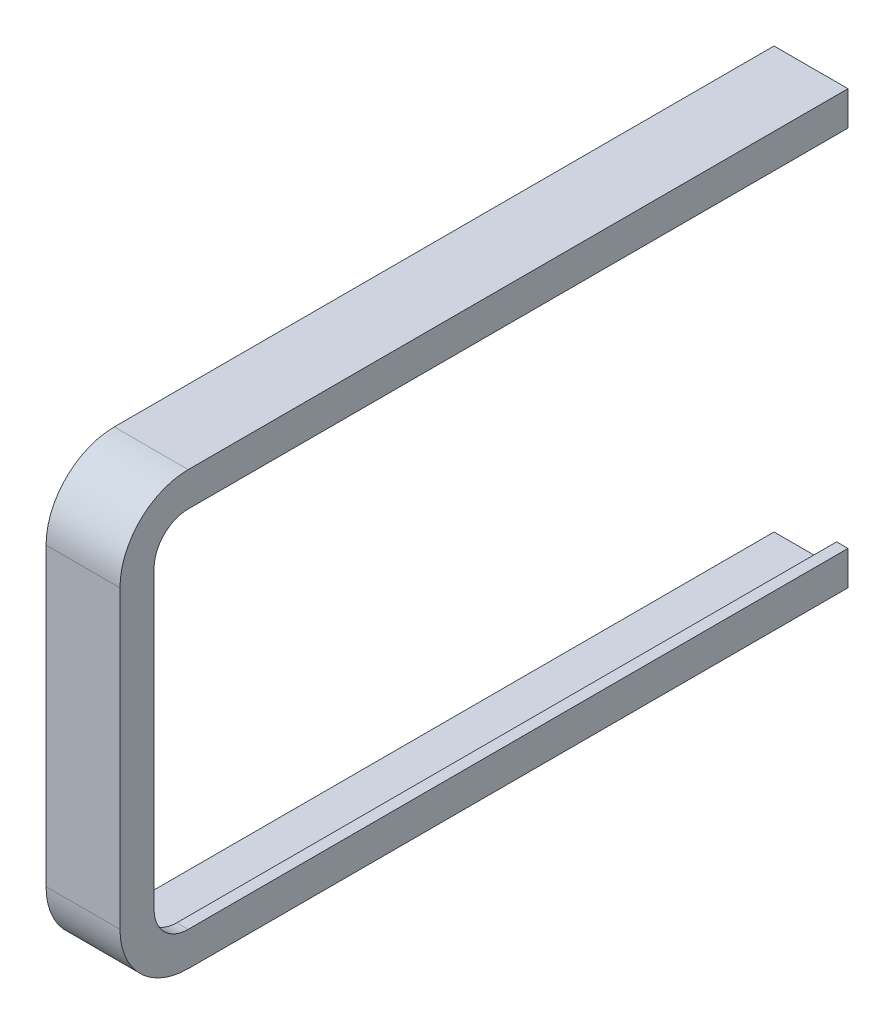
ISO-10303-21;
HEADER;
FILE_DESCRIPTION(('STEP AP214'),'2;1');
FILE_NAME('part.step','',(''),(''),'','','');
FILE_SCHEMA(('AUTOMOTIVE_DESIGN { 1 0 10303 214 1 1 1 1 }'));
ENDSEC;
DATA;
#1=APPLICATION_CONTEXT('core data for automotive mechanical design processes');
#2=APPLICATION_PROTOCOL_DEFINITION('international standard','automotive_design',2000,#1);
#3=PRODUCT_CONTEXT('',#1,'mechanical');
#4=PRODUCT('Part','Part','',(#3));
#5=PRODUCT_RELATED_PRODUCT_CATEGORY('part','',(#4));
#6=PRODUCT_DEFINITION_FORMATION('','',#4);
#7=PRODUCT_DEFINITION_CONTEXT('part definition',#1,'design');
#8=PRODUCT_DEFINITION('design','',#6,#7);
#9=PRODUCT_DEFINITION_SHAPE('','',#8);
#10=(LENGTH_UNIT() NAMED_UNIT(*) SI_UNIT(.MILLI.,.METRE.));
#11=(NAMED_UNIT(*) PLANE_ANGLE_UNIT() SI_UNIT($,.RADIAN.));
#12=(NAMED_UNIT(*) SI_UNIT($,.STERADIAN.) SOLID_ANGLE_UNIT());
#13=UNCERTAINTY_MEASURE_WITH_UNIT(LENGTH_MEASURE(1.E-05),#10,'distance_accuracy_value','');
#14=(GEOMETRIC_REPRESENTATION_CONTEXT(3) GLOBAL_UNCERTAINTY_ASSIGNED_CONTEXT((#13)) GLOBAL_UNIT_ASSIGNED_CONTEXT((#10,
#11,#12)) REPRESENTATION_CONTEXT('',''));
#15=CARTESIAN_POINT('',(0.,0.,0.));
#16=DIRECTION('',(0.,0.,1.));
#17=DIRECTION('',(1.,0.,0.));
#18=AXIS2_PLACEMENT_3D('',#15,#16,#17);
#19=CARTESIAN_POINT('',(86.141303169937,-53.8939234999562,0.));
#20=DIRECTION('',(-1.,0.,0.));
#21=DIRECTION('',(0.,-1.,0.));
#22=AXIS2_PLACEMENT_3D('',#19,#20,#21);
#23=CYLINDRICAL_SURFACE('',#22,19.0500000000104);
#24=CARTESIAN_POINT('',(106.778803169939,-53.893923499956,1.94289029309402E-13));
#25=DIRECTION('',(-1.,0.,0.));
#26=DIRECTION('',(0.,-1.,0.));
#27=AXIS2_PLACEMENT_3D('',#24,#25,#26);
#28=CIRCLE('',#27,19.0500000000104);
#29=CARTESIAN_POINT('',(106.778803169939,-72.9439234999664,0.));
#30=VERTEX_POINT('',#29);
#31=CARTESIAN_POINT('',(106.778803169939,-53.893923499956,19.0500000000106));
#32=VERTEX_POINT('',#31);
#33=EDGE_CURVE('E40',#30,#32,#28,.T.);
#34=ORIENTED_EDGE('',*,*,#33,.T.);
#35=DIRECTION('',(-1.,0.,0.));
#36=VECTOR('',#35,1.);
#37=CARTESIAN_POINT('',(106.778803169939,-53.893923499956,19.0500000000106));
#38=LINE('',#37,#36);
#39=CARTESIAN_POINT('',(86.1413031699389,-53.8939234999562,19.0500000000104));
#40=VERTEX_POINT('',#39);
#41=EDGE_CURVE('E275',#32,#40,#38,.T.);
#42=ORIENTED_EDGE('',*,*,#41,.T.);
#43=CARTESIAN_POINT('',(86.1413031699391,-53.8939234999562,0.));
#44=DIRECTION('',(-1.,0.,0.));
#45=DIRECTION('',(0.,-1.,0.));
#46=AXIS2_PLACEMENT_3D('',#43,#44,#45);
#47=CIRCLE('',#46,19.0500000000104);
#48=CARTESIAN_POINT('',(86.1413031699393,-72.9439234999666,0.));
#49=VERTEX_POINT('',#48);
#50=EDGE_CURVE('E11',#49,#40,#47,.T.);
#51=ORIENTED_EDGE('',*,*,#50,.F.);
#52=DIRECTION('',(-1.,0.,0.));
#53=VECTOR('',#52,1.);
#54=CARTESIAN_POINT('',(106.778803169939,-72.9439234999664,0.));
#55=LINE('',#54,#53);
#56=EDGE_CURVE('E49',#30,#49,#55,.T.);
#57=ORIENTED_EDGE('',*,*,#56,.F.);
#58=EDGE_LOOP('',(#34,#42,#51,#57));
#59=FACE_BOUND('',#58,.T.);
#60=ADVANCED_FACE('F30',(#59),#23,.T.);
#61=CARTESIAN_POINT('',(106.778803169939,-63.4189234999666,2.35922392732846E-13));
#62=DIRECTION('',(-1.,0.,0.));
#63=DIRECTION('',(0.,-1.,0.));
#64=AXIS2_PLACEMENT_3D('',#61,#62,#63);
#65=PLANE('',#64);
#66=CARTESIAN_POINT('',(106.778803169939,-53.893923499956,1.94289029309402E-13));
#67=DIRECTION('',(-1.,0.,0.));
#68=DIRECTION('',(0.,-1.,0.));
#69=AXIS2_PLACEMENT_3D('',#66,#67,#68);
#70=CIRCLE('',#69,9.52500000001067);
#71=CARTESIAN_POINT('',(106.778803169939,-63.4189234999666,2.35922392732846E-13));
#72=VERTEX_POINT('',#71);
#73=CARTESIAN_POINT('',(106.778803169939,-53.8939234999559,9.52500000001086));
#74=VERTEX_POINT('',#73);
#75=EDGE_CURVE('E295',#72,#74,#70,.T.);
#76=ORIENTED_EDGE('',*,*,#75,.T.);
#77=DIRECTION('',(0.,1.,0.));
#78=VECTOR('',#77,1.);
#79=CARTESIAN_POINT('',(106.778803169939,-53.8939234999559,9.52500000001057));
#80=LINE('',#79,#78);
#81=CARTESIAN_POINT('',(106.778803169939,28.6560765000409,9.52500000001086));
#82=VERTEX_POINT('',#81);
#83=EDGE_CURVE('E217',#74,#82,#80,.T.);
#84=ORIENTED_EDGE('',*,*,#83,.T.);
#85=CARTESIAN_POINT('',(106.778803169939,28.6560765000407,1.94289029309402E-13));
#86=DIRECTION('',(-1.,0.,0.));
#87=DIRECTION('',(0.,0.,1.));
#88=AXIS2_PLACEMENT_3D('',#85,#86,#87);
#89=CIRCLE('',#88,9.52500000001067);
#90=CARTESIAN_POINT('',(106.778803169939,38.1810765000514,0.));
#91=VERTEX_POINT('',#90);
#92=EDGE_CURVE('E228',#82,#91,#89,.T.);
#93=ORIENTED_EDGE('',*,*,#92,.T.);
#94=DIRECTION('',(0.,0.,-1.));
#95=VECTOR('',#94,1.);
#96=CARTESIAN_POINT('',(106.778803169939,38.1810765000514,0.));
#97=LINE('',#96,#95);
#98=CARTESIAN_POINT('',(106.778803169939,38.1810765000501,-184.15));
#99=VERTEX_POINT('',#98);
#100=EDGE_CURVE('E168',#91,#99,#97,.T.);
#101=ORIENTED_EDGE('',*,*,#100,.T.);
#102=DIRECTION('',(0.,1.,0.));
#103=VECTOR('',#102,1.);
#104=CARTESIAN_POINT('',(106.778803169939,38.1810765000501,-184.15));
#105=LINE('',#104,#103);
#106=CARTESIAN_POINT('',(106.778803169939,47.7060765000499,-184.15));
#107=VERTEX_POINT('',#106);
#108=EDGE_CURVE('E162',#99,#107,#105,.T.);
#109=ORIENTED_EDGE('',*,*,#108,.T.);
#110=DIRECTION('',(0.,0.,-1.));
#111=VECTOR('',#110,1.);
#112=CARTESIAN_POINT('',(106.778803169939,47.7060765000511,0.));
#113=LINE('',#112,#111);
#114=CARTESIAN_POINT('',(106.778803169939,47.7060765000511,0.));
#115=VERTEX_POINT('',#114);
#116=EDGE_CURVE('E166',#115,#107,#113,.T.);
#117=ORIENTED_EDGE('',*,*,#116,.F.);
#118=CARTESIAN_POINT('',(106.778803169939,28.6560765000407,1.94289029309402E-13));
#119=DIRECTION('',(-1.,0.,0.));
#120=DIRECTION('',(0.,0.,1.));
#121=AXIS2_PLACEMENT_3D('',#118,#119,#120);
#122=CIRCLE('',#121,19.0500000000104);
#123=CARTESIAN_POINT('',(106.778803169939,28.6560765000409,19.0500000000106));
#124=VERTEX_POINT('',#123);
#125=EDGE_CURVE('E230',#124,#115,#122,.T.);
#126=ORIENTED_EDGE('',*,*,#125,.F.);
#127=DIRECTION('',(0.,1.,0.));
#128=VECTOR('',#127,1.);
#129=CARTESIAN_POINT('',(106.778803169939,-53.8939234999559,19.0500000000103));
#130=LINE('',#129,#128);
#131=EDGE_CURVE('E257',#32,#124,#130,.T.);
#132=ORIENTED_EDGE('',*,*,#131,.F.);
#133=ORIENTED_EDGE('',*,*,#33,.F.);
#134=DIRECTION('',(0.,0.,-1.));
#135=VECTOR('',#134,1.);
#136=CARTESIAN_POINT('',(106.778803169937,-72.9439234999491,8.88178419700125E-13));
#137=LINE('',#136,#135);
#138=CARTESIAN_POINT('',(106.778803169937,-72.9439234999504,-184.149999999999));
#139=VERTEX_POINT('',#138);
#140=EDGE_CURVE('E205',#30,#139,#137,.T.);
#141=ORIENTED_EDGE('',*,*,#140,.T.);
#142=DIRECTION('',(0.,1.,0.));
#143=VECTOR('',#142,1.);
#144=CARTESIAN_POINT('',(106.778803169937,-72.9439234999504,-184.149999999999));
#145=LINE('',#144,#143);
#146=CARTESIAN_POINT('',(106.778803169937,-63.4189234999502,-184.149999999999));
#147=VERTEX_POINT('',#146);
#148=EDGE_CURVE('E182',#139,#147,#145,.T.);
#149=ORIENTED_EDGE('',*,*,#148,.T.);
#150=DIRECTION('',(0.,0.,-1.));
#151=VECTOR('',#150,1.);
#152=CARTESIAN_POINT('',(106.778803169937,-63.4189234999489,8.88178419700125E-13));
#153=LINE('',#152,#151);
#154=EDGE_CURVE('E203',#72,#147,#153,.T.);
#155=ORIENTED_EDGE('',*,*,#154,.F.);
#156=EDGE_LOOP('',(#76,#84,#93,#101,#109,#117,#126,#132,#133,#141,#149,#155));
#157=FACE_BOUND('',#156,.T.);
#158=ADVANCED_FACE('F304',(#157),#65,.F.);
#159=CARTESIAN_POINT('',(86.141303169937,-53.8939234999562,0.));
#160=DIRECTION('',(-1.,0.,0.));
#161=DIRECTION('',(0.,-1.,0.));
#162=AXIS2_PLACEMENT_3D('',#159,#160,#161);
#163=CYLINDRICAL_SURFACE('',#162,9.52500000001066);
#164=CARTESIAN_POINT('',(103.603803169939,-53.893923499956,1.66533453693773E-13));
#165=DIRECTION('',(-1.,0.,0.));
#166=DIRECTION('',(0.,-1.,0.));
#167=AXIS2_PLACEMENT_3D('',#164,#165,#166);
#168=CIRCLE('',#167,9.52500000001065);
#169=CARTESIAN_POINT('',(103.603803169939,-63.4189234999666,2.08166817117217E-13));
#170=VERTEX_POINT('',#169);
#171=CARTESIAN_POINT('',(103.603803169939,-53.8939234999559,9.52500000001081));
#172=VERTEX_POINT('',#171);
#173=EDGE_CURVE('E292',#170,#172,#168,.T.);
#174=ORIENTED_EDGE('',*,*,#173,.T.);
#175=DIRECTION('',(1.,0.,0.));
#176=VECTOR('',#175,1.);
#177=CARTESIAN_POINT('',(103.603803169939,-53.8939234999559,9.52500000001081));
#178=LINE('',#177,#176);
#179=EDGE_CURVE('E266',#172,#74,#178,.T.);
#180=ORIENTED_EDGE('',*,*,#179,.T.);
#181=ORIENTED_EDGE('',*,*,#75,.F.);
#182=DIRECTION('',(1.,0.,0.));
#183=VECTOR('',#182,1.);
#184=CARTESIAN_POINT('',(103.603803169939,-63.4189234999666,2.08166817117217E-13));
#185=LINE('',#184,#183);
#186=EDGE_CURVE('E283',#170,#72,#185,.T.);
#187=ORIENTED_EDGE('',*,*,#186,.F.);
#188=EDGE_LOOP('',(#174,#180,#181,#187));
#189=FACE_BOUND('',#188,.T.);
#190=ADVANCED_FACE('F322',(#189),#163,.F.);
#191=CARTESIAN_POINT('',(103.603803169939,-69.7689234999667,1.04083408558608E-13));
#192=DIRECTION('',(1.,0.,0.));
#193=DIRECTION('',(0.,1.,0.));
#194=AXIS2_PLACEMENT_3D('',#191,#192,#193);
#195=PLANE('',#194);
#196=CARTESIAN_POINT('',(103.603803169939,-53.893923499956,1.66533453693773E-13));
#197=DIRECTION('',(-1.,0.,0.));
#198=DIRECTION('',(0.,-1.,0.));
#199=AXIS2_PLACEMENT_3D('',#196,#197,#198);
#200=CIRCLE('',#199,15.8750000000107);
#201=CARTESIAN_POINT('',(103.603803169939,-69.7689234999667,1.04083408558608E-13));
#202=VERTEX_POINT('',#201);
#203=CARTESIAN_POINT('',(103.603803169939,-53.893923499956,15.8750000000108));
#204=VERTEX_POINT('',#203);
#205=EDGE_CURVE('E289',#202,#204,#200,.T.);
#206=ORIENTED_EDGE('',*,*,#205,.T.);
#207=DIRECTION('',(0.,1.,0.));
#208=VECTOR('',#207,1.);
#209=CARTESIAN_POINT('',(103.603803169939,-53.8939234999559,15.8750000000106));
#210=LINE('',#209,#208);
#211=CARTESIAN_POINT('',(103.603803169939,28.6560765000409,15.8750000000109));
#212=VERTEX_POINT('',#211);
#213=EDGE_CURVE('E250',#204,#212,#210,.T.);
#214=ORIENTED_EDGE('',*,*,#213,.T.);
#215=CARTESIAN_POINT('',(103.603803169939,28.6560765000407,1.94289029309402E-13));
#216=DIRECTION('',(-1.,0.,0.));
#217=DIRECTION('',(0.,0.,1.));
#218=AXIS2_PLACEMENT_3D('',#215,#216,#217);
#219=CIRCLE('',#218,15.8750000000107);
#220=CARTESIAN_POINT('',(103.603803169939,44.5310765000514,0.));
#221=VERTEX_POINT('',#220);
#222=EDGE_CURVE('E223',#212,#221,#219,.T.);
#223=ORIENTED_EDGE('',*,*,#222,.T.);
#224=DIRECTION('',(0.,0.,-1.));
#225=VECTOR('',#224,1.);
#226=CARTESIAN_POINT('',(103.603803169939,44.5310765000514,0.));
#227=LINE('',#226,#225);
#228=CARTESIAN_POINT('',(103.603803169939,44.5310765000501,-184.15));
#229=VERTEX_POINT('',#228);
#230=EDGE_CURVE('E34',#221,#229,#227,.T.);
#231=ORIENTED_EDGE('',*,*,#230,.T.);
#232=DIRECTION('',(0.,-1.,0.));
#233=VECTOR('',#232,1.);
#234=CARTESIAN_POINT('',(103.603803169939,44.5310765000501,-184.15));
#235=LINE('',#234,#233);
#236=CARTESIAN_POINT('',(103.603803169939,38.1810765000501,-184.15));
#237=VERTEX_POINT('',#236);
#238=EDGE_CURVE('E152',#229,#237,#235,.T.);
#239=ORIENTED_EDGE('',*,*,#238,.T.);
#240=DIRECTION('',(0.,0.,-1.));
#241=VECTOR('',#240,1.);
#242=CARTESIAN_POINT('',(103.603803169939,38.1810765000514,0.));
#243=LINE('',#242,#241);
#244=CARTESIAN_POINT('',(103.603803169939,38.1810765000514,0.));
#245=VERTEX_POINT('',#244);
#246=EDGE_CURVE('E170',#245,#237,#243,.T.);
#247=ORIENTED_EDGE('',*,*,#246,.F.);
#248=CARTESIAN_POINT('',(103.603803169939,28.6560765000407,1.94289029309402E-13));
#249=DIRECTION('',(-1.,0.,0.));
#250=DIRECTION('',(0.,0.,1.));
#251=AXIS2_PLACEMENT_3D('',#248,#249,#250);
#252=CIRCLE('',#251,9.52500000001065);
#253=CARTESIAN_POINT('',(103.603803169939,28.6560765000409,9.52500000001085));
#254=VERTEX_POINT('',#253);
#255=EDGE_CURVE('E225',#254,#245,#252,.T.);
#256=ORIENTED_EDGE('',*,*,#255,.F.);
#257=DIRECTION('',(0.,1.,0.));
#258=VECTOR('',#257,1.);
#259=CARTESIAN_POINT('',(103.603803169939,-53.8939234999559,9.52500000001055));
#260=LINE('',#259,#258);
#261=EDGE_CURVE('E248',#172,#254,#260,.T.);
#262=ORIENTED_EDGE('',*,*,#261,.F.);
#263=ORIENTED_EDGE('',*,*,#173,.F.);
#264=DIRECTION('',(0.,0.,-1.));
#265=VECTOR('',#264,1.);
#266=CARTESIAN_POINT('',(103.603803169939,-63.4189234999489,8.88178419700125E-13));
#267=LINE('',#266,#265);
#268=CARTESIAN_POINT('',(103.603803169939,-63.4189234999502,-184.149999999999));
#269=VERTEX_POINT('',#268);
#270=EDGE_CURVE('E200',#170,#269,#267,.T.);
#271=ORIENTED_EDGE('',*,*,#270,.T.);
#272=DIRECTION('',(0.,-1.,0.));
#273=VECTOR('',#272,1.);
#274=CARTESIAN_POINT('',(103.603803169939,-69.76892349995,-184.149999999999));
#275=LINE('',#274,#273);
#276=CARTESIAN_POINT('',(103.603803169939,-69.76892349995,-184.149999999999));
#277=VERTEX_POINT('',#276);
#278=EDGE_CURVE('E191',#269,#277,#275,.T.);
#279=ORIENTED_EDGE('',*,*,#278,.T.);
#280=DIRECTION('',(0.,0.,-1.));
#281=VECTOR('',#280,1.);
#282=CARTESIAN_POINT('',(103.603803169939,-69.7689234999488,8.88178419700125E-13));
#283=LINE('',#282,#281);
#284=EDGE_CURVE('E197',#202,#277,#283,.T.);
#285=ORIENTED_EDGE('',*,*,#284,.F.);
#286=EDGE_LOOP('',(#206,#214,#223,#231,#239,#247,#256,#262,#263,#271,#279,#285));
#287=FACE_BOUND('',#286,.T.);
#288=ADVANCED_FACE('F313',(#287),#195,.F.);
#289=CARTESIAN_POINT('',(86.1413031699393,-72.9439234999666,0.));
#290=DIRECTION('',(1.,0.,0.));
#291=DIRECTION('',(0.,1.,0.));
#292=AXIS2_PLACEMENT_3D('',#289,#290,#291);
#293=PLANE('',#292);
#294=ORIENTED_EDGE('',*,*,#50,.T.);
#295=DIRECTION('',(0.,1.,0.));
#296=VECTOR('',#295,1.);
#297=CARTESIAN_POINT('',(86.1413031699389,-53.8939234999559,19.0500000000103));
#298=LINE('',#297,#296);
#299=CARTESIAN_POINT('',(86.1413031699391,28.6560765000409,19.0500000000106));
#300=VERTEX_POINT('',#299);
#301=EDGE_CURVE('E256',#40,#300,#298,.T.);
#302=ORIENTED_EDGE('',*,*,#301,.T.);
#303=CARTESIAN_POINT('',(86.1413031699391,28.6560765000408,2.22044604925031E-13));
#304=DIRECTION('',(-1.,0.,0.));
#305=DIRECTION('',(0.,0.,1.));
#306=AXIS2_PLACEMENT_3D('',#303,#304,#305);
#307=CIRCLE('',#306,19.0500000000104);
#308=CARTESIAN_POINT('',(86.1413031699391,47.7060765000511,0.));
#309=VERTEX_POINT('',#308);
#310=EDGE_CURVE('E185',#300,#309,#307,.T.);
#311=ORIENTED_EDGE('',*,*,#310,.T.);
#312=DIRECTION('',(0.,0.,-1.));
#313=VECTOR('',#312,1.);
#314=CARTESIAN_POINT('',(86.1413031699391,47.7060765000511,0.));
#315=LINE('',#314,#313);
#316=CARTESIAN_POINT('',(86.1413031699391,47.7060765000499,-184.15));
#317=VERTEX_POINT('',#316);
#318=EDGE_CURVE('E140',#309,#317,#315,.T.);
#319=ORIENTED_EDGE('',*,*,#318,.T.);
#320=DIRECTION('',(0.,-1.,0.));
#321=VECTOR('',#320,1.);
#322=CARTESIAN_POINT('',(86.1413031699391,44.5310765000499,-184.15));
#323=LINE('',#322,#321);
#324=CARTESIAN_POINT('',(86.1413031699391,44.5310765000499,-184.15));
#325=VERTEX_POINT('',#324);
#326=EDGE_CURVE('E133',#317,#325,#323,.T.);
#327=ORIENTED_EDGE('',*,*,#326,.T.);
#328=DIRECTION('',(0.,0.,-1.));
#329=VECTOR('',#328,1.);
#330=CARTESIAN_POINT('',(86.1413031699391,44.5310765000511,0.));
#331=LINE('',#330,#329);
#332=CARTESIAN_POINT('',(86.1413031699391,44.5310765000511,0.));
#333=VERTEX_POINT('',#332);
#334=EDGE_CURVE('E137',#333,#325,#331,.T.);
#335=ORIENTED_EDGE('',*,*,#334,.F.);
#336=CARTESIAN_POINT('',(86.1413031699391,28.6560765000408,2.22044604925031E-13));
#337=DIRECTION('',(-1.,0.,0.));
#338=DIRECTION('',(0.,0.,1.));
#339=AXIS2_PLACEMENT_3D('',#336,#337,#338);
#340=CIRCLE('',#339,15.8750000000104);
#341=CARTESIAN_POINT('',(86.1413031699369,28.6560765000409,15.8750000000004));
#342=VERTEX_POINT('',#341);
#343=EDGE_CURVE('E221',#342,#333,#340,.T.);
#344=ORIENTED_EDGE('',*,*,#343,.F.);
#345=DIRECTION('',(0.,1.,0.));
#346=VECTOR('',#345,1.);
#347=CARTESIAN_POINT('',(86.1413031699367,-53.8939234999559,15.8750000000001));
#348=LINE('',#347,#346);
#349=CARTESIAN_POINT('',(86.1413031699389,-53.8939234999562,15.8750000000104));
#350=VERTEX_POINT('',#349);
#351=EDGE_CURVE('E253',#350,#342,#348,.T.);
#352=ORIENTED_EDGE('',*,*,#351,.F.);
#353=CARTESIAN_POINT('',(86.1413031699391,-53.8939234999562,0.));
#354=DIRECTION('',(-1.,0.,0.));
#355=DIRECTION('',(0.,-1.,0.));
#356=AXIS2_PLACEMENT_3D('',#353,#354,#355);
#357=CIRCLE('',#356,15.8750000000104);
#358=CARTESIAN_POINT('',(86.1413031699392,-69.7689234999666,0.));
#359=VERTEX_POINT('',#358);
#360=EDGE_CURVE('E287',#359,#350,#357,.T.);
#361=ORIENTED_EDGE('',*,*,#360,.F.);
#362=DIRECTION('',(0.,0.,-1.));
#363=VECTOR('',#362,1.);
#364=CARTESIAN_POINT('',(86.141303169939,-69.7689234999491,8.88178419700125E-13));
#365=LINE('',#364,#363);
#366=CARTESIAN_POINT('',(86.141303169939,-69.7689234999504,-184.149999999999));
#367=VERTEX_POINT('',#366);
#368=EDGE_CURVE('E195',#359,#367,#365,.T.);
#369=ORIENTED_EDGE('',*,*,#368,.T.);
#370=DIRECTION('',(0.,-1.,0.));
#371=VECTOR('',#370,1.);
#372=CARTESIAN_POINT('',(86.141303169939,-69.7689234999504,-184.149999999999));
#373=LINE('',#372,#371);
#374=CARTESIAN_POINT('',(86.141303169939,-72.9439234999504,-184.149999999999));
#375=VERTEX_POINT('',#374);
#376=EDGE_CURVE('E174',#367,#375,#373,.T.);
#377=ORIENTED_EDGE('',*,*,#376,.T.);
#378=DIRECTION('',(0.,0.,-1.));
#379=VECTOR('',#378,1.);
#380=CARTESIAN_POINT('',(86.141303169939,-72.9439234999491,8.88178419700125E-13));
#381=LINE('',#380,#379);
#382=EDGE_CURVE('E158',#49,#375,#381,.T.);
#383=ORIENTED_EDGE('',*,*,#382,.F.);
#384=EDGE_LOOP('',(#294,#302,#311,#319,#327,#335,#344,#352,#361,#369,#377,#383));
#385=FACE_BOUND('',#384,.T.);
#386=ADVANCED_FACE('F135',(#385),#293,.F.);
#387=CARTESIAN_POINT('',(86.141303169937,-53.8939234999562,0.));
#388=DIRECTION('',(-1.,0.,0.));
#389=DIRECTION('',(0.,-1.,0.));
#390=AXIS2_PLACEMENT_3D('',#387,#388,#389);
#391=CYLINDRICAL_SURFACE('',#390,15.8750000000105);
#392=DIRECTION('',(1.,0.,0.));
#393=VECTOR('',#392,1.);
#394=CARTESIAN_POINT('',(86.1413031699392,-69.7689234999666,0.));
#395=LINE('',#394,#393);
#396=EDGE_CURVE('E280',#359,#202,#395,.T.);
#397=ORIENTED_EDGE('',*,*,#396,.F.);
#398=ORIENTED_EDGE('',*,*,#360,.T.);
#399=DIRECTION('',(1.,0.,0.));
#400=VECTOR('',#399,1.);
#401=CARTESIAN_POINT('',(86.1413031699389,-53.8939234999562,15.8750000000104));
#402=LINE('',#401,#400);
#403=EDGE_CURVE('E263',#350,#204,#402,.T.);
#404=ORIENTED_EDGE('',*,*,#403,.T.);
#405=ORIENTED_EDGE('',*,*,#205,.F.);
#406=EDGE_LOOP('',(#397,#398,#404,#405));
#407=FACE_BOUND('',#406,.T.);
#408=ADVANCED_FACE('F348',(#407),#391,.F.);
#409=CARTESIAN_POINT('',(103.603803169939,44.5310765000501,-184.15));
#410=DIRECTION('',(0.,0.,-1.));
#411=DIRECTION('',(-1.,0.,0.));
#412=AXIS2_PLACEMENT_3D('',#409,#410,#411);
#413=PLANE('',#412);
#414=DIRECTION('',(1.,0.,0.));
#415=VECTOR('',#414,1.);
#416=CARTESIAN_POINT('',(86.1413031699391,44.5310765000499,-184.15));
#417=LINE('',#416,#415);
#418=EDGE_CURVE('E147',#325,#229,#417,.T.);
#419=ORIENTED_EDGE('',*,*,#418,.F.);
#420=ORIENTED_EDGE('',*,*,#326,.F.);
#421=DIRECTION('',(-1.,0.,0.));
#422=VECTOR('',#421,1.);
#423=CARTESIAN_POINT('',(86.1413031699391,47.7060765000499,-184.15));
#424=LINE('',#423,#422);
#425=EDGE_CURVE('E127',#107,#317,#424,.T.);
#426=ORIENTED_EDGE('',*,*,#425,.F.);
#427=ORIENTED_EDGE('',*,*,#108,.F.);
#428=DIRECTION('',(1.,0.,0.));
#429=VECTOR('',#428,1.);
#430=CARTESIAN_POINT('',(103.603803169939,38.1810765000501,-184.15));
#431=LINE('',#430,#429);
#432=EDGE_CURVE('E155',#237,#99,#431,.T.);
#433=ORIENTED_EDGE('',*,*,#432,.F.);
#434=ORIENTED_EDGE('',*,*,#238,.F.);
#435=EDGE_LOOP('',(#419,#420,#426,#427,#433,#434));
#436=FACE_BOUND('',#435,.T.);
#437=ADVANCED_FACE('F150',(#436),#413,.T.);
#438=CARTESIAN_POINT('',(86.1413031699391,47.7060765000511,0.));
#439=DIRECTION('',(0.,-1.,0.));
#440=DIRECTION('',(0.,0.,-1.));
#441=AXIS2_PLACEMENT_3D('',#438,#439,#440);
#442=PLANE('',#441);
#443=ORIENTED_EDGE('',*,*,#425,.T.);
#444=ORIENTED_EDGE('',*,*,#318,.F.);
#445=DIRECTION('',(-1.,0.,0.));
#446=VECTOR('',#445,1.);
#447=CARTESIAN_POINT('',(106.778803169939,47.7060765000511,0.));
#448=LINE('',#447,#446);
#449=EDGE_CURVE('E214',#115,#309,#448,.T.);
#450=ORIENTED_EDGE('',*,*,#449,.F.);
#451=ORIENTED_EDGE('',*,*,#116,.T.);
#452=EDGE_LOOP('',(#443,#444,#450,#451));
#453=FACE_BOUND('',#452,.T.);
#454=ADVANCED_FACE('F307',(#453),#442,.F.);
#455=CARTESIAN_POINT('',(103.603803169939,38.1810765000514,0.));
#456=DIRECTION('',(0.,1.,0.));
#457=DIRECTION('',(0.,0.,1.));
#458=AXIS2_PLACEMENT_3D('',#455,#456,#457);
#459=PLANE('',#458);
#460=ORIENTED_EDGE('',*,*,#432,.T.);
#461=ORIENTED_EDGE('',*,*,#100,.F.);
#462=DIRECTION('',(1.,0.,0.));
#463=VECTOR('',#462,1.);
#464=CARTESIAN_POINT('',(103.603803169939,38.1810765000514,0.));
#465=LINE('',#464,#463);
#466=EDGE_CURVE('E210',#245,#91,#465,.T.);
#467=ORIENTED_EDGE('',*,*,#466,.F.);
#468=ORIENTED_EDGE('',*,*,#246,.T.);
#469=EDGE_LOOP('',(#460,#461,#467,#468));
#470=FACE_BOUND('',#469,.T.);
#471=ADVANCED_FACE('F309',(#470),#459,.F.);
#472=CARTESIAN_POINT('',(86.1413031699391,44.5310765000511,0.));
#473=DIRECTION('',(0.,1.,0.));
#474=DIRECTION('',(1.,0.,0.));
#475=AXIS2_PLACEMENT_3D('',#472,#473,#474);
#476=PLANE('',#475);
#477=ORIENTED_EDGE('',*,*,#418,.T.);
#478=ORIENTED_EDGE('',*,*,#230,.F.);
#479=DIRECTION('',(1.,0.,0.));
#480=VECTOR('',#479,1.);
#481=CARTESIAN_POINT('',(86.1413031699391,44.5310765000511,0.));
#482=LINE('',#481,#480);
#483=EDGE_CURVE('E148',#333,#221,#482,.T.);
#484=ORIENTED_EDGE('',*,*,#483,.F.);
#485=ORIENTED_EDGE('',*,*,#334,.T.);
#486=EDGE_LOOP('',(#477,#478,#484,#485));
#487=FACE_BOUND('',#486,.T.);
#488=ADVANCED_FACE('F32',(#487),#476,.F.);
#489=CARTESIAN_POINT('',(86.1413031699371,28.6560765000408,2.22044604925031E-13));
#490=DIRECTION('',(-1.,0.,0.));
#491=DIRECTION('',(0.,0.,1.));
#492=AXIS2_PLACEMENT_3D('',#489,#490,#491);
#493=CYLINDRICAL_SURFACE('',#492,19.0500000000104);
#494=ORIENTED_EDGE('',*,*,#125,.T.);
#495=ORIENTED_EDGE('',*,*,#449,.T.);
#496=ORIENTED_EDGE('',*,*,#310,.F.);
#497=DIRECTION('',(-1.,0.,0.));
#498=VECTOR('',#497,1.);
#499=CARTESIAN_POINT('',(106.778803169939,28.6560765000409,19.0500000000106));
#500=LINE('',#499,#498);
#501=EDGE_CURVE('E237',#124,#300,#500,.T.);
#502=ORIENTED_EDGE('',*,*,#501,.F.);
#503=EDGE_LOOP('',(#494,#495,#496,#502));
#504=FACE_BOUND('',#503,.T.);
#505=ADVANCED_FACE('F365',(#504),#493,.T.);
#506=CARTESIAN_POINT('',(106.778803169939,-53.8939234999559,19.0500000000103));
#507=DIRECTION('',(0.,0.,-1.));
#508=DIRECTION('',(0.,1.,0.));
#509=AXIS2_PLACEMENT_3D('',#506,#507,#508);
#510=PLANE('',#509);
#511=ORIENTED_EDGE('',*,*,#501,.T.);
#512=ORIENTED_EDGE('',*,*,#301,.F.);
#513=ORIENTED_EDGE('',*,*,#41,.F.);
#514=ORIENTED_EDGE('',*,*,#131,.T.);
#515=EDGE_LOOP('',(#511,#512,#513,#514));
#516=FACE_BOUND('',#515,.T.);
#517=ADVANCED_FACE('F362',(#516),#510,.F.);
#518=CARTESIAN_POINT('',(86.1413031699371,28.6560765000408,2.22044604925031E-13));
#519=DIRECTION('',(-1.,0.,0.));
#520=DIRECTION('',(0.,0.,1.));
#521=AXIS2_PLACEMENT_3D('',#518,#519,#520);
#522=CYLINDRICAL_SURFACE('',#521,9.52500000001066);
#523=ORIENTED_EDGE('',*,*,#255,.T.);
#524=ORIENTED_EDGE('',*,*,#466,.T.);
#525=ORIENTED_EDGE('',*,*,#92,.F.);
#526=DIRECTION('',(1.,0.,0.));
#527=VECTOR('',#526,1.);
#528=CARTESIAN_POINT('',(103.603803169939,28.6560765000409,9.52500000001085));
#529=LINE('',#528,#527);
#530=EDGE_CURVE('E234',#254,#82,#529,.T.);
#531=ORIENTED_EDGE('',*,*,#530,.F.);
#532=EDGE_LOOP('',(#523,#524,#525,#531));
#533=FACE_BOUND('',#532,.T.);
#534=ADVANCED_FACE('F311',(#533),#522,.F.);
#535=CARTESIAN_POINT('',(103.603803169939,-53.8939234999559,9.52500000001055));
#536=DIRECTION('',(0.,0.,1.));
#537=DIRECTION('',(1.,0.,0.));
#538=AXIS2_PLACEMENT_3D('',#535,#536,#537);
#539=PLANE('',#538);
#540=ORIENTED_EDGE('',*,*,#530,.T.);
#541=ORIENTED_EDGE('',*,*,#83,.F.);
#542=ORIENTED_EDGE('',*,*,#179,.F.);
#543=ORIENTED_EDGE('',*,*,#261,.T.);
#544=EDGE_LOOP('',(#540,#541,#542,#543));
#545=FACE_BOUND('',#544,.T.);
#546=ADVANCED_FACE('F318',(#545),#539,.F.);
#547=CARTESIAN_POINT('',(86.1413031699371,28.6560765000408,2.22044604925031E-13));
#548=DIRECTION('',(-1.,0.,0.));
#549=DIRECTION('',(0.,0.,1.));
#550=AXIS2_PLACEMENT_3D('',#547,#548,#549);
#551=CYLINDRICAL_SURFACE('',#550,15.8750000000105);
#552=DIRECTION('',(1.,0.,5.97629001086631E-13));
#553=VECTOR('',#552,1.);
#554=CARTESIAN_POINT('',(86.1413031699369,28.6560765000409,15.8750000000004));
#555=LINE('',#554,#553);
#556=EDGE_CURVE('E243',#342,#212,#555,.T.);
#557=ORIENTED_EDGE('',*,*,#556,.F.);
#558=ORIENTED_EDGE('',*,*,#343,.T.);
#559=ORIENTED_EDGE('',*,*,#483,.T.);
#560=ORIENTED_EDGE('',*,*,#222,.F.);
#561=EDGE_LOOP('',(#557,#558,#559,#560));
#562=FACE_BOUND('',#561,.T.);
#563=ADVANCED_FACE('F353',(#562),#551,.F.);
#564=CARTESIAN_POINT('',(86.1413031699367,-53.8939234999559,15.8750000000001));
#565=DIRECTION('',(-5.97629001086631E-13,0.,1.));
#566=DIRECTION('',(1.,0.,5.97629001086631E-13));
#567=AXIS2_PLACEMENT_3D('',#564,#565,#566);
#568=PLANE('',#567);
#569=ORIENTED_EDGE('',*,*,#556,.T.);
#570=ORIENTED_EDGE('',*,*,#213,.F.);
#571=ORIENTED_EDGE('',*,*,#403,.F.);
#572=ORIENTED_EDGE('',*,*,#351,.T.);
#573=EDGE_LOOP('',(#569,#570,#571,#572));
#574=FACE_BOUND('',#573,.T.);
#575=ADVANCED_FACE('F352',(#574),#568,.F.);
#576=CARTESIAN_POINT('',(86.141303169939,-69.7689234999491,8.88178419700125E-13));
#577=DIRECTION('',(0.,-1.,0.));
#578=DIRECTION('',(-1.,0.,0.));
#579=AXIS2_PLACEMENT_3D('',#576,#577,#578);
#580=PLANE('',#579);
#581=DIRECTION('',(-1.,0.,0.));
#582=VECTOR('',#581,1.);
#583=CARTESIAN_POINT('',(86.141303169939,-69.7689234999504,-184.149999999999));
#584=LINE('',#583,#582);
#585=EDGE_CURVE('E193',#277,#367,#584,.T.);
#586=ORIENTED_EDGE('',*,*,#585,.T.);
#587=ORIENTED_EDGE('',*,*,#368,.F.);
#588=ORIENTED_EDGE('',*,*,#396,.T.);
#589=ORIENTED_EDGE('',*,*,#284,.T.);
#590=EDGE_LOOP('',(#586,#587,#588,#589));
#591=FACE_BOUND('',#590,.T.);
#592=ADVANCED_FACE('F345',(#591),#580,.F.);
#593=CARTESIAN_POINT('',(106.778803169937,-63.4189234999489,8.88178419700125E-13));
#594=DIRECTION('',(0.,-1.,0.));
#595=DIRECTION('',(0.,0.,-1.));
#596=AXIS2_PLACEMENT_3D('',#593,#594,#595);
#597=PLANE('',#596);
#598=DIRECTION('',(-1.,0.,0.));
#599=VECTOR('',#598,1.);
#600=CARTESIAN_POINT('',(106.778803169937,-63.4189234999502,-184.149999999999));
#601=LINE('',#600,#599);
#602=EDGE_CURVE('E189',#147,#269,#601,.T.);
#603=ORIENTED_EDGE('',*,*,#602,.T.);
#604=ORIENTED_EDGE('',*,*,#270,.F.);
#605=ORIENTED_EDGE('',*,*,#186,.T.);
#606=ORIENTED_EDGE('',*,*,#154,.T.);
#607=EDGE_LOOP('',(#603,#604,#605,#606));
#608=FACE_BOUND('',#607,.T.);
#609=ADVANCED_FACE('F337',(#608),#597,.F.);
#610=CARTESIAN_POINT('',(86.141303169939,-72.9439234999504,-184.149999999999));
#611=DIRECTION('',(0.,0.,1.));
#612=DIRECTION('',(1.,0.,0.));
#613=AXIS2_PLACEMENT_3D('',#610,#611,#612);
#614=PLANE('',#613);
#615=ORIENTED_EDGE('',*,*,#376,.F.);
#616=ORIENTED_EDGE('',*,*,#585,.F.);
#617=ORIENTED_EDGE('',*,*,#278,.F.);
#618=ORIENTED_EDGE('',*,*,#602,.F.);
#619=ORIENTED_EDGE('',*,*,#148,.F.);
#620=DIRECTION('',(1.,0.,0.));
#621=VECTOR('',#620,1.);
#622=CARTESIAN_POINT('',(86.141303169939,-72.9439234999504,-184.149999999999));
#623=LINE('',#622,#621);
#624=EDGE_CURVE('E178',#375,#139,#623,.T.);
#625=ORIENTED_EDGE('',*,*,#624,.F.);
#626=EDGE_LOOP('',(#615,#616,#617,#618,#619,#625));
#627=FACE_BOUND('',#626,.T.);
#628=ADVANCED_FACE('F340',(#627),#614,.F.);
#629=CARTESIAN_POINT('',(86.141303169939,-72.9439234999491,8.88178419700125E-13));
#630=DIRECTION('',(0.,1.,0.));
#631=DIRECTION('',(0.,0.,1.));
#632=AXIS2_PLACEMENT_3D('',#629,#630,#631);
#633=PLANE('',#632);
#634=ORIENTED_EDGE('',*,*,#624,.T.);
#635=ORIENTED_EDGE('',*,*,#140,.F.);
#636=ORIENTED_EDGE('',*,*,#56,.T.);
#637=ORIENTED_EDGE('',*,*,#382,.T.);
#638=EDGE_LOOP('',(#634,#635,#636,#637));
#639=FACE_BOUND('',#638,.T.);
#640=ADVANCED_FACE('F385',(#639),#633,.F.);
#641=CLOSED_SHELL('',(#60,#158,#190,#288,#386,#408,#437,#454,#471,#488,#505,#517,#534,#546,#563,
#575,#592,#609,#628,#640));
#642=MANIFOLD_SOLID_BREP('B2',#641);
#643=ADVANCED_BREP_SHAPE_REPRESENTATION('',(#18,#642),#14);
#644=SHAPE_DEFINITION_REPRESENTATION(#9,#643);
ENDSEC;
END-ISO-10303-21;
